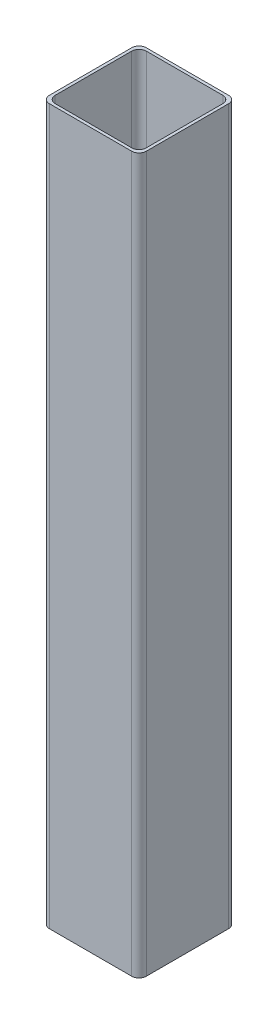
ISO-10303-21;
HEADER;
FILE_DESCRIPTION(('STEP AP214'),'2;1');
FILE_NAME('part.step','',(''),(''),'','','');
FILE_SCHEMA(('AUTOMOTIVE_DESIGN { 1 0 10303 214 1 1 1 1 }'));
ENDSEC;
DATA;
#1=APPLICATION_CONTEXT('core data for automotive mechanical design processes');
#2=APPLICATION_PROTOCOL_DEFINITION('international standard','automotive_design',2000,#1);
#3=PRODUCT_CONTEXT('',#1,'mechanical');
#4=PRODUCT('Part','Part','',(#3));
#5=PRODUCT_RELATED_PRODUCT_CATEGORY('part','',(#4));
#6=PRODUCT_DEFINITION_FORMATION('','',#4);
#7=PRODUCT_DEFINITION_CONTEXT('part definition',#1,'design');
#8=PRODUCT_DEFINITION('design','',#6,#7);
#9=PRODUCT_DEFINITION_SHAPE('','',#8);
#10=(LENGTH_UNIT() NAMED_UNIT(*) SI_UNIT(.MILLI.,.METRE.));
#11=(NAMED_UNIT(*) PLANE_ANGLE_UNIT() SI_UNIT($,.RADIAN.));
#12=(NAMED_UNIT(*) SI_UNIT($,.STERADIAN.) SOLID_ANGLE_UNIT());
#13=UNCERTAINTY_MEASURE_WITH_UNIT(LENGTH_MEASURE(1.E-05),#10,'distance_accuracy_value','');
#14=(GEOMETRIC_REPRESENTATION_CONTEXT(3) GLOBAL_UNCERTAINTY_ASSIGNED_CONTEXT((#13)) GLOBAL_UNIT_ASSIGNED_CONTEXT((#10,
#11,#12)) REPRESENTATION_CONTEXT('',''));
#15=CARTESIAN_POINT('',(0.,0.,0.));
#16=DIRECTION('',(0.,0.,1.));
#17=DIRECTION('',(1.,0.,0.));
#18=AXIS2_PLACEMENT_3D('',#15,#16,#17);
#19=CARTESIAN_POINT('',(0.,147.5,0.));
#20=DIRECTION('',(0.,1.,0.));
#21=DIRECTION('',(0.,0.,1.));
#22=AXIS2_PLACEMENT_3D('',#19,#20,#21);
#23=PLANE('',#22);
#24=DIRECTION('',(-1.,0.,0.));
#25=VECTOR('',#24,1.);
#26=CARTESIAN_POINT('',(20.,147.5,-20.));
#27=LINE('',#26,#25);
#28=CARTESIAN_POINT('',(17.,147.5,-20.));
#29=VERTEX_POINT('',#28);
#30=CARTESIAN_POINT('',(-17.,147.5,-20.));
#31=VERTEX_POINT('',#30);
#32=EDGE_CURVE('E183',#29,#31,#27,.T.);
#33=ORIENTED_EDGE('',*,*,#32,.T.);
#34=CARTESIAN_POINT('',(-17.,147.5,-17.));
#35=DIRECTION('',(0.,1.,0.));
#36=DIRECTION('',(0.,0.,1.));
#37=AXIS2_PLACEMENT_3D('',#34,#35,#36);
#38=CIRCLE('',#37,3.);
#39=CARTESIAN_POINT('',(-20.,147.5,-17.));
#40=VERTEX_POINT('',#39);
#41=EDGE_CURVE('E203',#31,#40,#38,.T.);
#42=ORIENTED_EDGE('',*,*,#41,.T.);
#43=DIRECTION('',(0.,0.,1.));
#44=VECTOR('',#43,1.);
#45=CARTESIAN_POINT('',(-20.,147.5,20.));
#46=LINE('',#45,#44);
#47=CARTESIAN_POINT('',(-20.,147.5,17.));
#48=VERTEX_POINT('',#47);
#49=EDGE_CURVE('E165',#40,#48,#46,.T.);
#50=ORIENTED_EDGE('',*,*,#49,.T.);
#51=CARTESIAN_POINT('',(-17.,147.5,17.));
#52=DIRECTION('',(0.,1.,0.));
#53=DIRECTION('',(0.,0.,1.));
#54=AXIS2_PLACEMENT_3D('',#51,#52,#53);
#55=CIRCLE('',#54,3.);
#56=CARTESIAN_POINT('',(-17.,147.5,20.));
#57=VERTEX_POINT('',#56);
#58=EDGE_CURVE('E199',#48,#57,#55,.T.);
#59=ORIENTED_EDGE('',*,*,#58,.T.);
#60=DIRECTION('',(1.,0.,0.));
#61=VECTOR('',#60,1.);
#62=CARTESIAN_POINT('',(20.,147.5,20.));
#63=LINE('',#62,#61);
#64=CARTESIAN_POINT('',(17.,147.5,20.));
#65=VERTEX_POINT('',#64);
#66=EDGE_CURVE('E275',#57,#65,#63,.T.);
#67=ORIENTED_EDGE('',*,*,#66,.T.);
#68=CARTESIAN_POINT('',(17.,147.5,17.));
#69=DIRECTION('',(0.,1.,0.));
#70=DIRECTION('',(0.,0.,1.));
#71=AXIS2_PLACEMENT_3D('',#68,#69,#70);
#72=CIRCLE('',#71,3.);
#73=CARTESIAN_POINT('',(20.,147.5,17.));
#74=VERTEX_POINT('',#73);
#75=EDGE_CURVE('E197',#65,#74,#72,.T.);
#76=ORIENTED_EDGE('',*,*,#75,.T.);
#77=DIRECTION('',(0.,0.,-1.));
#78=VECTOR('',#77,1.);
#79=CARTESIAN_POINT('',(20.,147.5,20.));
#80=LINE('',#79,#78);
#81=CARTESIAN_POINT('',(20.,147.5,-17.));
#82=VERTEX_POINT('',#81);
#83=EDGE_CURVE('E277',#74,#82,#80,.T.);
#84=ORIENTED_EDGE('',*,*,#83,.T.);
#85=CARTESIAN_POINT('',(17.,147.5,-17.));
#86=DIRECTION('',(0.,1.,0.));
#87=DIRECTION('',(0.,0.,1.));
#88=AXIS2_PLACEMENT_3D('',#85,#86,#87);
#89=CIRCLE('',#88,3.);
#90=EDGE_CURVE('E201',#82,#29,#89,.T.);
#91=ORIENTED_EDGE('',*,*,#90,.T.);
#92=EDGE_LOOP('',(#33,#42,#50,#59,#67,#76,#84,#91));
#93=FACE_BOUND('',#92,.T.);
#94=DIRECTION('',(0.,0.,-1.));
#95=VECTOR('',#94,1.);
#96=CARTESIAN_POINT('',(18.8,147.5,18.8));
#97=LINE('',#96,#95);
#98=CARTESIAN_POINT('',(18.8,147.5,15.8));
#99=VERTEX_POINT('',#98);
#100=CARTESIAN_POINT('',(18.8,147.5,-15.8));
#101=VERTEX_POINT('',#100);
#102=EDGE_CURVE('E261',#99,#101,#97,.T.);
#103=ORIENTED_EDGE('',*,*,#102,.F.);
#104=CARTESIAN_POINT('',(15.8,147.5,15.8));
#105=DIRECTION('',(0.,1.,0.));
#106=DIRECTION('',(0.,0.,1.));
#107=AXIS2_PLACEMENT_3D('',#104,#105,#106);
#108=CIRCLE('',#107,3.);
#109=CARTESIAN_POINT('',(15.8,147.5,18.8));
#110=VERTEX_POINT('',#109);
#111=EDGE_CURVE('E240',#99,#110,#108,.F.);
#112=ORIENTED_EDGE('',*,*,#111,.T.);
#113=DIRECTION('',(1.,0.,0.));
#114=VECTOR('',#113,1.);
#115=CARTESIAN_POINT('',(18.8,147.5,18.8));
#116=LINE('',#115,#114);
#117=CARTESIAN_POINT('',(-15.8,147.5,18.8));
#118=VERTEX_POINT('',#117);
#119=EDGE_CURVE('E256',#118,#110,#116,.T.);
#120=ORIENTED_EDGE('',*,*,#119,.F.);
#121=CARTESIAN_POINT('',(-15.8,147.5,15.8));
#122=DIRECTION('',(0.,1.,0.));
#123=DIRECTION('',(0.,0.,1.));
#124=AXIS2_PLACEMENT_3D('',#121,#122,#123);
#125=CIRCLE('',#124,3.);
#126=CARTESIAN_POINT('',(-18.8,147.5,15.8));
#127=VERTEX_POINT('',#126);
#128=EDGE_CURVE('E244',#118,#127,#125,.F.);
#129=ORIENTED_EDGE('',*,*,#128,.T.);
#130=DIRECTION('',(0.,0.,1.));
#131=VECTOR('',#130,1.);
#132=CARTESIAN_POINT('',(-18.8,147.5,18.8));
#133=LINE('',#132,#131);
#134=CARTESIAN_POINT('',(-18.8,147.5,-15.8));
#135=VERTEX_POINT('',#134);
#136=EDGE_CURVE('E174',#135,#127,#133,.T.);
#137=ORIENTED_EDGE('',*,*,#136,.F.);
#138=CARTESIAN_POINT('',(-15.8,147.5,-15.8));
#139=DIRECTION('',(0.,1.,0.));
#140=DIRECTION('',(0.,0.,1.));
#141=AXIS2_PLACEMENT_3D('',#138,#139,#140);
#142=CIRCLE('',#141,3.);
#143=CARTESIAN_POINT('',(-15.8,147.5,-18.8));
#144=VERTEX_POINT('',#143);
#145=EDGE_CURVE('E11',#135,#144,#142,.F.);
#146=ORIENTED_EDGE('',*,*,#145,.T.);
#147=DIRECTION('',(-1.,0.,0.));
#148=VECTOR('',#147,1.);
#149=CARTESIAN_POINT('',(18.8,147.5,-18.8));
#150=LINE('',#149,#148);
#151=CARTESIAN_POINT('',(15.8,147.5,-18.8));
#152=VERTEX_POINT('',#151);
#153=EDGE_CURVE('E180',#152,#144,#150,.T.);
#154=ORIENTED_EDGE('',*,*,#153,.F.);
#155=CARTESIAN_POINT('',(15.8,147.5,-15.8));
#156=DIRECTION('',(0.,1.,0.));
#157=DIRECTION('',(0.,0.,1.));
#158=AXIS2_PLACEMENT_3D('',#155,#156,#157);
#159=CIRCLE('',#158,3.);
#160=EDGE_CURVE('E236',#152,#101,#159,.F.);
#161=ORIENTED_EDGE('',*,*,#160,.T.);
#162=EDGE_LOOP('',(#103,#112,#120,#129,#137,#146,#154,#161));
#163=FACE_BOUND('',#162,.T.);
#164=ADVANCED_FACE('F32',(#93,#163),#23,.T.);
#165=CARTESIAN_POINT('',(0.,-147.5,0.));
#166=DIRECTION('',(0.,1.,0.));
#167=DIRECTION('',(0.,0.,1.));
#168=AXIS2_PLACEMENT_3D('',#165,#166,#167);
#169=PLANE('',#168);
#170=DIRECTION('',(0.,0.,1.));
#171=VECTOR('',#170,1.);
#172=CARTESIAN_POINT('',(-20.,-147.5,20.));
#173=LINE('',#172,#171);
#174=CARTESIAN_POINT('',(-20.,-147.5,-17.));
#175=VERTEX_POINT('',#174);
#176=CARTESIAN_POINT('',(-20.,-147.5,17.));
#177=VERTEX_POINT('',#176);
#178=EDGE_CURVE('E162',#175,#177,#173,.T.);
#179=ORIENTED_EDGE('',*,*,#178,.F.);
#180=CARTESIAN_POINT('',(-17.,-147.5,-17.));
#181=DIRECTION('',(0.,1.,0.));
#182=DIRECTION('',(0.,0.,1.));
#183=AXIS2_PLACEMENT_3D('',#180,#181,#182);
#184=CIRCLE('',#183,3.);
#185=CARTESIAN_POINT('',(-17.,-147.5,-20.));
#186=VERTEX_POINT('',#185);
#187=EDGE_CURVE('E145',#175,#186,#184,.F.);
#188=ORIENTED_EDGE('',*,*,#187,.T.);
#189=DIRECTION('',(-1.,0.,0.));
#190=VECTOR('',#189,1.);
#191=CARTESIAN_POINT('',(20.,-147.5,-20.));
#192=LINE('',#191,#190);
#193=CARTESIAN_POINT('',(17.,-147.5,-20.));
#194=VERTEX_POINT('',#193);
#195=EDGE_CURVE('E188',#194,#186,#192,.T.);
#196=ORIENTED_EDGE('',*,*,#195,.F.);
#197=CARTESIAN_POINT('',(17.,-147.5,-17.));
#198=DIRECTION('',(0.,1.,0.));
#199=DIRECTION('',(0.,0.,1.));
#200=AXIS2_PLACEMENT_3D('',#197,#198,#199);
#201=CIRCLE('',#200,3.);
#202=CARTESIAN_POINT('',(20.,-147.5,-17.));
#203=VERTEX_POINT('',#202);
#204=EDGE_CURVE('E156',#194,#203,#201,.F.);
#205=ORIENTED_EDGE('',*,*,#204,.T.);
#206=DIRECTION('',(0.,0.,-1.));
#207=VECTOR('',#206,1.);
#208=CARTESIAN_POINT('',(20.,-147.5,20.));
#209=LINE('',#208,#207);
#210=CARTESIAN_POINT('',(20.,-147.5,17.));
#211=VERTEX_POINT('',#210);
#212=EDGE_CURVE('E177',#211,#203,#209,.T.);
#213=ORIENTED_EDGE('',*,*,#212,.F.);
#214=CARTESIAN_POINT('',(17.,-147.5,17.));
#215=DIRECTION('',(0.,1.,0.));
#216=DIRECTION('',(0.,0.,1.));
#217=AXIS2_PLACEMENT_3D('',#214,#215,#216);
#218=CIRCLE('',#217,3.);
#219=CARTESIAN_POINT('',(17.,-147.5,20.));
#220=VERTEX_POINT('',#219);
#221=EDGE_CURVE('E166',#211,#220,#218,.F.);
#222=ORIENTED_EDGE('',*,*,#221,.T.);
#223=DIRECTION('',(1.,0.,0.));
#224=VECTOR('',#223,1.);
#225=CARTESIAN_POINT('',(20.,-147.5,20.));
#226=LINE('',#225,#224);
#227=CARTESIAN_POINT('',(-17.,-147.5,20.));
#228=VERTEX_POINT('',#227);
#229=EDGE_CURVE('E173',#228,#220,#226,.T.);
#230=ORIENTED_EDGE('',*,*,#229,.F.);
#231=CARTESIAN_POINT('',(-17.,-147.5,17.));
#232=DIRECTION('',(0.,1.,0.));
#233=DIRECTION('',(0.,0.,1.));
#234=AXIS2_PLACEMENT_3D('',#231,#232,#233);
#235=CIRCLE('',#234,3.);
#236=EDGE_CURVE('E172',#228,#177,#235,.F.);
#237=ORIENTED_EDGE('',*,*,#236,.T.);
#238=EDGE_LOOP('',(#179,#188,#196,#205,#213,#222,#230,#237));
#239=FACE_BOUND('',#238,.T.);
#240=DIRECTION('',(0.,0.,1.));
#241=VECTOR('',#240,1.);
#242=CARTESIAN_POINT('',(-18.8,-147.5,18.8));
#243=LINE('',#242,#241);
#244=CARTESIAN_POINT('',(-18.8,-147.5,-15.8));
#245=VERTEX_POINT('',#244);
#246=CARTESIAN_POINT('',(-18.8,-147.5,15.8));
#247=VERTEX_POINT('',#246);
#248=EDGE_CURVE('E248',#245,#247,#243,.T.);
#249=ORIENTED_EDGE('',*,*,#248,.T.);
#250=CARTESIAN_POINT('',(-15.8,-147.5,15.8));
#251=DIRECTION('',(0.,1.,0.));
#252=DIRECTION('',(0.,0.,1.));
#253=AXIS2_PLACEMENT_3D('',#250,#251,#252);
#254=CIRCLE('',#253,3.);
#255=CARTESIAN_POINT('',(-15.8,-147.5,18.8));
#256=VERTEX_POINT('',#255);
#257=EDGE_CURVE('E242',#247,#256,#254,.T.);
#258=ORIENTED_EDGE('',*,*,#257,.T.);
#259=DIRECTION('',(1.,0.,0.));
#260=VECTOR('',#259,1.);
#261=CARTESIAN_POINT('',(18.8,-147.5,18.8));
#262=LINE('',#261,#260);
#263=CARTESIAN_POINT('',(15.8,-147.5,18.8));
#264=VERTEX_POINT('',#263);
#265=EDGE_CURVE('E267',#256,#264,#262,.T.);
#266=ORIENTED_EDGE('',*,*,#265,.T.);
#267=CARTESIAN_POINT('',(15.8,-147.5,15.8));
#268=DIRECTION('',(0.,1.,0.));
#269=DIRECTION('',(0.,0.,1.));
#270=AXIS2_PLACEMENT_3D('',#267,#268,#269);
#271=CIRCLE('',#270,3.);
#272=CARTESIAN_POINT('',(18.8,-147.5,15.8));
#273=VERTEX_POINT('',#272);
#274=EDGE_CURVE('E238',#264,#273,#271,.T.);
#275=ORIENTED_EDGE('',*,*,#274,.T.);
#276=DIRECTION('',(0.,0.,-1.));
#277=VECTOR('',#276,1.);
#278=CARTESIAN_POINT('',(18.8,-147.5,18.8));
#279=LINE('',#278,#277);
#280=CARTESIAN_POINT('',(18.8,-147.5,-15.8));
#281=VERTEX_POINT('',#280);
#282=EDGE_CURVE('E270',#273,#281,#279,.T.);
#283=ORIENTED_EDGE('',*,*,#282,.T.);
#284=CARTESIAN_POINT('',(15.8,-147.5,-15.8));
#285=DIRECTION('',(0.,1.,0.));
#286=DIRECTION('',(0.,0.,1.));
#287=AXIS2_PLACEMENT_3D('',#284,#285,#286);
#288=CIRCLE('',#287,3.);
#289=CARTESIAN_POINT('',(15.8,-147.5,-18.8));
#290=VERTEX_POINT('',#289);
#291=EDGE_CURVE('E234',#281,#290,#288,.T.);
#292=ORIENTED_EDGE('',*,*,#291,.T.);
#293=DIRECTION('',(-1.,0.,0.));
#294=VECTOR('',#293,1.);
#295=CARTESIAN_POINT('',(18.8,-147.5,-18.8));
#296=LINE('',#295,#294);
#297=CARTESIAN_POINT('',(-15.8,-147.5,-18.8));
#298=VERTEX_POINT('',#297);
#299=EDGE_CURVE('E249',#290,#298,#296,.T.);
#300=ORIENTED_EDGE('',*,*,#299,.T.);
#301=CARTESIAN_POINT('',(-15.8,-147.5,-15.8));
#302=DIRECTION('',(0.,1.,0.));
#303=DIRECTION('',(0.,0.,1.));
#304=AXIS2_PLACEMENT_3D('',#301,#302,#303);
#305=CIRCLE('',#304,3.);
#306=EDGE_CURVE('E40',#298,#245,#305,.T.);
#307=ORIENTED_EDGE('',*,*,#306,.T.);
#308=EDGE_LOOP('',(#249,#258,#266,#275,#283,#292,#300,#307));
#309=FACE_BOUND('',#308,.T.);
#310=ADVANCED_FACE('F169',(#239,#309),#169,.F.);
#311=CARTESIAN_POINT('',(-20.,147.5,20.));
#312=DIRECTION('',(1.,0.,0.));
#313=DIRECTION('',(0.,0.,-1.));
#314=AXIS2_PLACEMENT_3D('',#311,#312,#313);
#315=PLANE('',#314);
#316=ORIENTED_EDGE('',*,*,#49,.F.);
#317=DIRECTION('',(0.,-1.,0.));
#318=VECTOR('',#317,1.);
#319=CARTESIAN_POINT('',(-20.,147.5,-17.));
#320=LINE('',#319,#318);
#321=EDGE_CURVE('E149',#40,#175,#320,.T.);
#322=ORIENTED_EDGE('',*,*,#321,.T.);
#323=ORIENTED_EDGE('',*,*,#178,.T.);
#324=DIRECTION('',(0.,-1.,0.));
#325=VECTOR('',#324,1.);
#326=CARTESIAN_POINT('',(-20.,147.5,17.));
#327=LINE('',#326,#325);
#328=EDGE_CURVE('E167',#177,#48,#327,.F.);
#329=ORIENTED_EDGE('',*,*,#328,.T.);
#330=EDGE_LOOP('',(#316,#322,#323,#329));
#331=FACE_BOUND('',#330,.T.);
#332=ADVANCED_FACE('F161',(#331),#315,.F.);
#333=CARTESIAN_POINT('',(20.,147.5,20.));
#334=DIRECTION('',(0.,0.,-1.));
#335=DIRECTION('',(-1.,0.,0.));
#336=AXIS2_PLACEMENT_3D('',#333,#334,#335);
#337=PLANE('',#336);
#338=ORIENTED_EDGE('',*,*,#66,.F.);
#339=DIRECTION('',(0.,-1.,0.));
#340=VECTOR('',#339,1.);
#341=CARTESIAN_POINT('',(-17.,147.5,20.));
#342=LINE('',#341,#340);
#343=EDGE_CURVE('E231',#57,#228,#342,.T.);
#344=ORIENTED_EDGE('',*,*,#343,.T.);
#345=ORIENTED_EDGE('',*,*,#229,.T.);
#346=DIRECTION('',(0.,-1.,0.));
#347=VECTOR('',#346,1.);
#348=CARTESIAN_POINT('',(17.,147.5,20.));
#349=LINE('',#348,#347);
#350=EDGE_CURVE('E229',#220,#65,#349,.F.);
#351=ORIENTED_EDGE('',*,*,#350,.T.);
#352=EDGE_LOOP('',(#338,#344,#345,#351));
#353=FACE_BOUND('',#352,.T.);
#354=ADVANCED_FACE('F299',(#353),#337,.F.);
#355=CARTESIAN_POINT('',(20.,147.5,20.));
#356=DIRECTION('',(-1.,0.,0.));
#357=DIRECTION('',(0.,0.,1.));
#358=AXIS2_PLACEMENT_3D('',#355,#356,#357);
#359=PLANE('',#358);
#360=ORIENTED_EDGE('',*,*,#212,.T.);
#361=DIRECTION('',(0.,-1.,0.));
#362=VECTOR('',#361,1.);
#363=CARTESIAN_POINT('',(20.,147.5,-17.));
#364=LINE('',#363,#362);
#365=EDGE_CURVE('E208',#203,#82,#364,.F.);
#366=ORIENTED_EDGE('',*,*,#365,.T.);
#367=ORIENTED_EDGE('',*,*,#83,.F.);
#368=DIRECTION('',(0.,-1.,0.));
#369=VECTOR('',#368,1.);
#370=CARTESIAN_POINT('',(20.,147.5,17.));
#371=LINE('',#370,#369);
#372=EDGE_CURVE('E205',#74,#211,#371,.T.);
#373=ORIENTED_EDGE('',*,*,#372,.T.);
#374=EDGE_LOOP('',(#360,#366,#367,#373));
#375=FACE_BOUND('',#374,.T.);
#376=ADVANCED_FACE('F292',(#375),#359,.F.);
#377=CARTESIAN_POINT('',(20.,147.5,-20.));
#378=DIRECTION('',(0.,0.,1.));
#379=DIRECTION('',(1.,0.,0.));
#380=AXIS2_PLACEMENT_3D('',#377,#378,#379);
#381=PLANE('',#380);
#382=ORIENTED_EDGE('',*,*,#195,.T.);
#383=DIRECTION('',(0.,-1.,0.));
#384=VECTOR('',#383,1.);
#385=CARTESIAN_POINT('',(-17.,147.5,-20.));
#386=LINE('',#385,#384);
#387=EDGE_CURVE('E150',#186,#31,#386,.F.);
#388=ORIENTED_EDGE('',*,*,#387,.T.);
#389=ORIENTED_EDGE('',*,*,#32,.F.);
#390=DIRECTION('',(0.,-1.,0.));
#391=VECTOR('',#390,1.);
#392=CARTESIAN_POINT('',(17.,147.5,-20.));
#393=LINE('',#392,#391);
#394=EDGE_CURVE('E155',#29,#194,#393,.T.);
#395=ORIENTED_EDGE('',*,*,#394,.T.);
#396=EDGE_LOOP('',(#382,#388,#389,#395));
#397=FACE_BOUND('',#396,.T.);
#398=ADVANCED_FACE('F286',(#397),#381,.F.);
#399=CARTESIAN_POINT('',(18.8,147.5,18.8));
#400=DIRECTION('',(0.,0.,-1.));
#401=DIRECTION('',(-1.,0.,0.));
#402=AXIS2_PLACEMENT_3D('',#399,#400,#401);
#403=PLANE('',#402);
#404=ORIENTED_EDGE('',*,*,#119,.T.);
#405=DIRECTION('',(0.,-1.,0.));
#406=VECTOR('',#405,1.);
#407=CARTESIAN_POINT('',(15.8,-147.5,18.8));
#408=LINE('',#407,#406);
#409=EDGE_CURVE('E221',#110,#264,#408,.T.);
#410=ORIENTED_EDGE('',*,*,#409,.T.);
#411=ORIENTED_EDGE('',*,*,#265,.F.);
#412=DIRECTION('',(0.,-1.,0.));
#413=VECTOR('',#412,1.);
#414=CARTESIAN_POINT('',(-15.8,147.5,18.8));
#415=LINE('',#414,#413);
#416=EDGE_CURVE('E219',#256,#118,#415,.F.);
#417=ORIENTED_EDGE('',*,*,#416,.T.);
#418=EDGE_LOOP('',(#404,#410,#411,#417));
#419=FACE_BOUND('',#418,.T.);
#420=ADVANCED_FACE('F318',(#419),#403,.T.);
#421=CARTESIAN_POINT('',(18.8,147.5,18.8));
#422=DIRECTION('',(-1.,0.,0.));
#423=DIRECTION('',(0.,0.,1.));
#424=AXIS2_PLACEMENT_3D('',#421,#422,#423);
#425=PLANE('',#424);
#426=ORIENTED_EDGE('',*,*,#102,.T.);
#427=DIRECTION('',(0.,-1.,0.));
#428=VECTOR('',#427,1.);
#429=CARTESIAN_POINT('',(18.8,-147.5,-15.8));
#430=LINE('',#429,#428);
#431=EDGE_CURVE('E212',#101,#281,#430,.T.);
#432=ORIENTED_EDGE('',*,*,#431,.T.);
#433=ORIENTED_EDGE('',*,*,#282,.F.);
#434=DIRECTION('',(0.,-1.,0.));
#435=VECTOR('',#434,1.);
#436=CARTESIAN_POINT('',(18.8,147.5,15.8));
#437=LINE('',#436,#435);
#438=EDGE_CURVE('E210',#273,#99,#437,.F.);
#439=ORIENTED_EDGE('',*,*,#438,.T.);
#440=EDGE_LOOP('',(#426,#432,#433,#439));
#441=FACE_BOUND('',#440,.T.);
#442=ADVANCED_FACE('F357',(#441),#425,.T.);
#443=CARTESIAN_POINT('',(18.8,147.5,-18.8));
#444=DIRECTION('',(0.,0.,1.));
#445=DIRECTION('',(1.,0.,0.));
#446=AXIS2_PLACEMENT_3D('',#443,#444,#445);
#447=PLANE('',#446);
#448=ORIENTED_EDGE('',*,*,#299,.F.);
#449=DIRECTION('',(0.,-1.,0.));
#450=VECTOR('',#449,1.);
#451=CARTESIAN_POINT('',(15.8,147.5,-18.8));
#452=LINE('',#451,#450);
#453=EDGE_CURVE('E52',#290,#152,#452,.F.);
#454=ORIENTED_EDGE('',*,*,#453,.T.);
#455=ORIENTED_EDGE('',*,*,#153,.T.);
#456=DIRECTION('',(0.,-1.,0.));
#457=VECTOR('',#456,1.);
#458=CARTESIAN_POINT('',(-15.8,-147.5,-18.8));
#459=LINE('',#458,#457);
#460=EDGE_CURVE('E215',#144,#298,#459,.T.);
#461=ORIENTED_EDGE('',*,*,#460,.T.);
#462=EDGE_LOOP('',(#448,#454,#455,#461));
#463=FACE_BOUND('',#462,.T.);
#464=ADVANCED_FACE('F259',(#463),#447,.T.);
#465=CARTESIAN_POINT('',(-18.8,147.5,18.8));
#466=DIRECTION('',(1.,0.,0.));
#467=DIRECTION('',(0.,0.,-1.));
#468=AXIS2_PLACEMENT_3D('',#465,#466,#467);
#469=PLANE('',#468);
#470=ORIENTED_EDGE('',*,*,#136,.T.);
#471=DIRECTION('',(0.,-1.,0.));
#472=VECTOR('',#471,1.);
#473=CARTESIAN_POINT('',(-18.8,-147.5,15.8));
#474=LINE('',#473,#472);
#475=EDGE_CURVE('E226',#127,#247,#474,.T.);
#476=ORIENTED_EDGE('',*,*,#475,.T.);
#477=ORIENTED_EDGE('',*,*,#248,.F.);
#478=DIRECTION('',(0.,-1.,0.));
#479=VECTOR('',#478,1.);
#480=CARTESIAN_POINT('',(-18.8,147.5,-15.8));
#481=LINE('',#480,#479);
#482=EDGE_CURVE('E224',#245,#135,#481,.F.);
#483=ORIENTED_EDGE('',*,*,#482,.T.);
#484=EDGE_LOOP('',(#470,#476,#477,#483));
#485=FACE_BOUND('',#484,.T.);
#486=ADVANCED_FACE('F254',(#485),#469,.T.);
#487=CARTESIAN_POINT('',(-17.,147.5,-17.));
#488=DIRECTION('',(0.,-1.,0.));
#489=DIRECTION('',(0.,0.,-1.));
#490=AXIS2_PLACEMENT_3D('',#487,#488,#489);
#491=CYLINDRICAL_SURFACE('',#490,3.);
#492=ORIENTED_EDGE('',*,*,#41,.F.);
#493=ORIENTED_EDGE('',*,*,#387,.F.);
#494=ORIENTED_EDGE('',*,*,#187,.F.);
#495=ORIENTED_EDGE('',*,*,#321,.F.);
#496=EDGE_LOOP('',(#492,#493,#494,#495));
#497=FACE_BOUND('',#496,.T.);
#498=ADVANCED_FACE('F148',(#497),#491,.T.);
#499=CARTESIAN_POINT('',(17.,147.5,-17.));
#500=DIRECTION('',(0.,-1.,0.));
#501=DIRECTION('',(0.,0.,-1.));
#502=AXIS2_PLACEMENT_3D('',#499,#500,#501);
#503=CYLINDRICAL_SURFACE('',#502,3.);
#504=ORIENTED_EDGE('',*,*,#90,.F.);
#505=ORIENTED_EDGE('',*,*,#365,.F.);
#506=ORIENTED_EDGE('',*,*,#204,.F.);
#507=ORIENTED_EDGE('',*,*,#394,.F.);
#508=EDGE_LOOP('',(#504,#505,#506,#507));
#509=FACE_BOUND('',#508,.T.);
#510=ADVANCED_FACE('F288',(#509),#503,.T.);
#511=CARTESIAN_POINT('',(15.8,147.5,-15.8));
#512=DIRECTION('',(0.,1.,0.));
#513=DIRECTION('',(0.,0.,1.));
#514=AXIS2_PLACEMENT_3D('',#511,#512,#513);
#515=CYLINDRICAL_SURFACE('',#514,3.);
#516=ORIENTED_EDGE('',*,*,#160,.F.);
#517=ORIENTED_EDGE('',*,*,#453,.F.);
#518=ORIENTED_EDGE('',*,*,#291,.F.);
#519=ORIENTED_EDGE('',*,*,#431,.F.);
#520=EDGE_LOOP('',(#516,#517,#518,#519));
#521=FACE_BOUND('',#520,.T.);
#522=ADVANCED_FACE('F333',(#521),#515,.F.);
#523=CARTESIAN_POINT('',(15.8,147.5,15.8));
#524=DIRECTION('',(0.,1.,0.));
#525=DIRECTION('',(0.,0.,1.));
#526=AXIS2_PLACEMENT_3D('',#523,#524,#525);
#527=CYLINDRICAL_SURFACE('',#526,3.);
#528=ORIENTED_EDGE('',*,*,#111,.F.);
#529=ORIENTED_EDGE('',*,*,#438,.F.);
#530=ORIENTED_EDGE('',*,*,#274,.F.);
#531=ORIENTED_EDGE('',*,*,#409,.F.);
#532=EDGE_LOOP('',(#528,#529,#530,#531));
#533=FACE_BOUND('',#532,.T.);
#534=ADVANCED_FACE('F336',(#533),#527,.F.);
#535=CARTESIAN_POINT('',(-15.8,147.5,15.8));
#536=DIRECTION('',(0.,1.,0.));
#537=DIRECTION('',(0.,0.,1.));
#538=AXIS2_PLACEMENT_3D('',#535,#536,#537);
#539=CYLINDRICAL_SURFACE('',#538,3.);
#540=ORIENTED_EDGE('',*,*,#128,.F.);
#541=ORIENTED_EDGE('',*,*,#416,.F.);
#542=ORIENTED_EDGE('',*,*,#257,.F.);
#543=ORIENTED_EDGE('',*,*,#475,.F.);
#544=EDGE_LOOP('',(#540,#541,#542,#543));
#545=FACE_BOUND('',#544,.T.);
#546=ADVANCED_FACE('F309',(#545),#539,.F.);
#547=CARTESIAN_POINT('',(-15.8,147.5,-15.8));
#548=DIRECTION('',(0.,1.,0.));
#549=DIRECTION('',(0.,0.,1.));
#550=AXIS2_PLACEMENT_3D('',#547,#548,#549);
#551=CYLINDRICAL_SURFACE('',#550,3.);
#552=ORIENTED_EDGE('',*,*,#145,.F.);
#553=ORIENTED_EDGE('',*,*,#482,.F.);
#554=ORIENTED_EDGE('',*,*,#306,.F.);
#555=ORIENTED_EDGE('',*,*,#460,.F.);
#556=EDGE_LOOP('',(#552,#553,#554,#555));
#557=FACE_BOUND('',#556,.T.);
#558=ADVANCED_FACE('F258',(#557),#551,.F.);
#559=CARTESIAN_POINT('',(-17.,147.5,17.));
#560=DIRECTION('',(0.,-1.,0.));
#561=DIRECTION('',(0.,0.,-1.));
#562=AXIS2_PLACEMENT_3D('',#559,#560,#561);
#563=CYLINDRICAL_SURFACE('',#562,3.);
#564=ORIENTED_EDGE('',*,*,#58,.F.);
#565=ORIENTED_EDGE('',*,*,#328,.F.);
#566=ORIENTED_EDGE('',*,*,#236,.F.);
#567=ORIENTED_EDGE('',*,*,#343,.F.);
#568=EDGE_LOOP('',(#564,#565,#566,#567));
#569=FACE_BOUND('',#568,.T.);
#570=ADVANCED_FACE('F303',(#569),#563,.T.);
#571=CARTESIAN_POINT('',(17.,147.5,17.));
#572=DIRECTION('',(0.,-1.,0.));
#573=DIRECTION('',(0.,0.,-1.));
#574=AXIS2_PLACEMENT_3D('',#571,#572,#573);
#575=CYLINDRICAL_SURFACE('',#574,3.);
#576=ORIENTED_EDGE('',*,*,#75,.F.);
#577=ORIENTED_EDGE('',*,*,#350,.F.);
#578=ORIENTED_EDGE('',*,*,#221,.F.);
#579=ORIENTED_EDGE('',*,*,#372,.F.);
#580=EDGE_LOOP('',(#576,#577,#578,#579));
#581=FACE_BOUND('',#580,.T.);
#582=ADVANCED_FACE('F34',(#581),#575,.T.);
#583=CLOSED_SHELL('',(#164,#310,#332,#354,#376,#398,#420,#442,#464,#486,#498,#510,#522,#534,
#546,#558,#570,#582));
#584=MANIFOLD_SOLID_BREP('B2',#583);
#585=ADVANCED_BREP_SHAPE_REPRESENTATION('',(#18,#584),#14);
#586=SHAPE_DEFINITION_REPRESENTATION(#9,#585);
ENDSEC;
END-ISO-10303-21;
